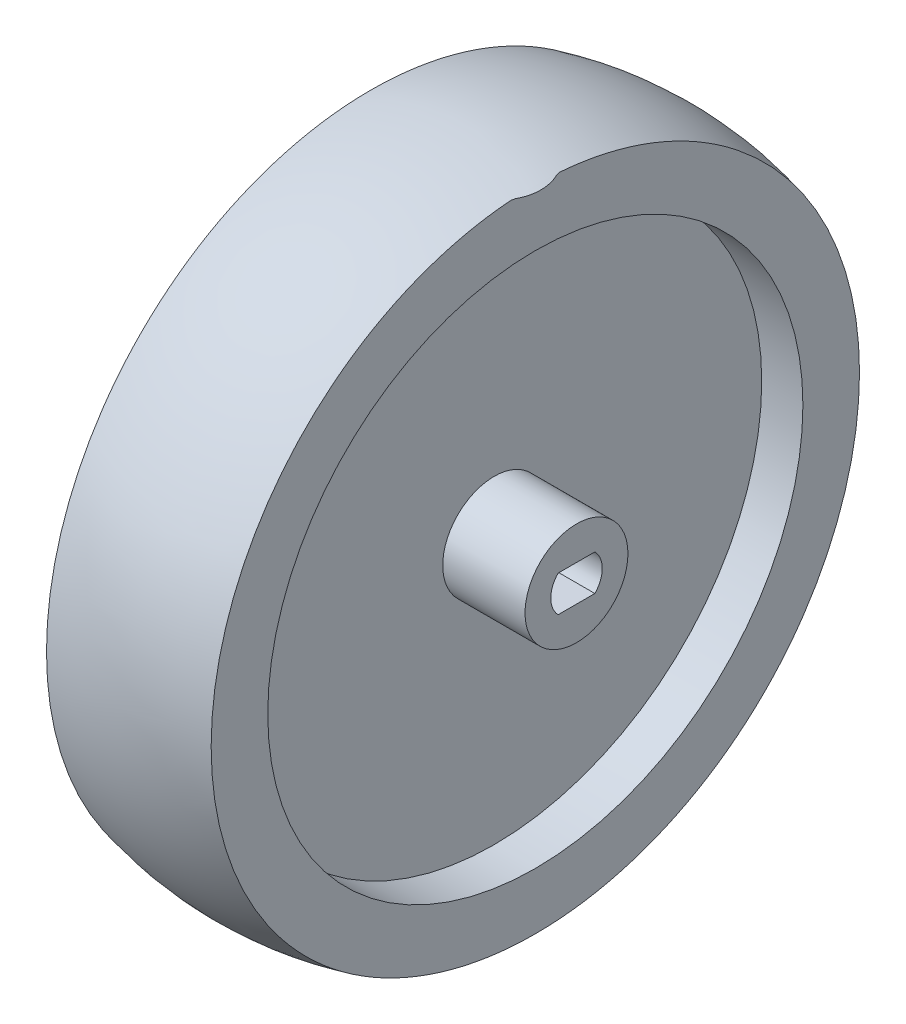
ISO-10303-21;
HEADER;
FILE_DESCRIPTION(('STEP AP214'),'2;1');
FILE_NAME('part.step','',(''),(''),'','','');
FILE_SCHEMA(('AUTOMOTIVE_DESIGN { 1 0 10303 214 1 1 1 1 }'));
ENDSEC;
DATA;
#1=APPLICATION_CONTEXT('core data for automotive mechanical design processes');
#2=APPLICATION_PROTOCOL_DEFINITION('international standard','automotive_design',2000,#1);
#3=PRODUCT_CONTEXT('',#1,'mechanical');
#4=PRODUCT('Part','Part','',(#3));
#5=PRODUCT_RELATED_PRODUCT_CATEGORY('part','',(#4));
#6=PRODUCT_DEFINITION_FORMATION('','',#4);
#7=PRODUCT_DEFINITION_CONTEXT('part definition',#1,'design');
#8=PRODUCT_DEFINITION('design','',#6,#7);
#9=PRODUCT_DEFINITION_SHAPE('','',#8);
#10=(LENGTH_UNIT() NAMED_UNIT(*) SI_UNIT(.MILLI.,.METRE.));
#11=(NAMED_UNIT(*) PLANE_ANGLE_UNIT() SI_UNIT($,.RADIAN.));
#12=(NAMED_UNIT(*) SI_UNIT($,.STERADIAN.) SOLID_ANGLE_UNIT());
#13=UNCERTAINTY_MEASURE_WITH_UNIT(LENGTH_MEASURE(1.E-05),#10,'distance_accuracy_value','');
#14=(GEOMETRIC_REPRESENTATION_CONTEXT(3) GLOBAL_UNCERTAINTY_ASSIGNED_CONTEXT((#13)) GLOBAL_UNIT_ASSIGNED_CONTEXT((#10,
#11,#12)) REPRESENTATION_CONTEXT('',''));
#15=CARTESIAN_POINT('',(0.,0.,0.));
#16=DIRECTION('',(0.,0.,1.));
#17=DIRECTION('',(1.,0.,0.));
#18=AXIS2_PLACEMENT_3D('',#15,#16,#17);
#19=CARTESIAN_POINT('',(4.,0.,0.));
#20=DIRECTION('',(1.,0.,0.));
#21=DIRECTION('',(0.,0.,-1.));
#22=AXIS2_PLACEMENT_3D('',#19,#20,#21);
#23=PLANE('',#22);
#24=CARTESIAN_POINT('',(4.,0.,0.));
#25=DIRECTION('',(1.,0.,0.));
#26=DIRECTION('',(0.,0.,-1.));
#27=AXIS2_PLACEMENT_3D('',#24,#25,#26);
#28=CIRCLE('',#27,1.75);
#29=CARTESIAN_POINT('',(4.,1.75,0.));
#30=VERTEX_POINT('',#29);
#31=CARTESIAN_POINT('',(4.,-1.75,0.));
#32=VERTEX_POINT('',#31);
#33=EDGE_CURVE('E12',#30,#32,#28,.T.);
#34=ORIENTED_EDGE('',*,*,#33,.F.);
#35=DIRECTION('',(0.,0.,1.));
#36=VECTOR('',#35,1.);
#37=CARTESIAN_POINT('',(4.,1.75,1.78535710713571));
#38=LINE('',#37,#36);
#39=CARTESIAN_POINT('',(4.,1.75,1.78535710713571));
#40=VERTEX_POINT('',#39);
#41=EDGE_CURVE('E92',#30,#40,#38,.T.);
#42=ORIENTED_EDGE('',*,*,#41,.T.);
#43=CARTESIAN_POINT('',(4.,0.,0.));
#44=DIRECTION('',(1.,0.,0.));
#45=DIRECTION('',(0.,0.,-1.));
#46=AXIS2_PLACEMENT_3D('',#43,#44,#45);
#47=CIRCLE('',#46,2.5);
#48=CARTESIAN_POINT('',(4.,-1.75,1.78535710713571));
#49=VERTEX_POINT('',#48);
#50=EDGE_CURVE('E56',#40,#49,#47,.T.);
#51=ORIENTED_EDGE('',*,*,#50,.T.);
#52=DIRECTION('',(0.,0.,-1.));
#53=VECTOR('',#52,1.);
#54=CARTESIAN_POINT('',(4.,-1.75,-1.78535710713571));
#55=LINE('',#54,#53);
#56=EDGE_CURVE('E93',#49,#32,#55,.T.);
#57=ORIENTED_EDGE('',*,*,#56,.T.);
#58=EDGE_LOOP('',(#34,#42,#51,#57));
#59=FACE_BOUND('',#58,.T.);
#60=ADVANCED_FACE('F36',(#59),#23,.T.);
#61=CARTESIAN_POINT('',(4.,0.,0.));
#62=DIRECTION('',(1.,0.,0.));
#63=DIRECTION('',(0.,0.,-1.));
#64=AXIS2_PLACEMENT_3D('',#61,#62,#63);
#65=CIRCLE('',#64,26.);
#66=CARTESIAN_POINT('',(4.,0.,-26.));
#67=VERTEX_POINT('',#66);
#68=EDGE_CURVE('E135',#67,#67,#65,.T.);
#69=ORIENTED_EDGE('',*,*,#68,.T.);
#70=EDGE_LOOP('',(#69));
#71=FACE_BOUND('',#70,.T.);
#72=CARTESIAN_POINT('',(4.,0.,0.));
#73=DIRECTION('',(1.,0.,0.));
#74=DIRECTION('',(0.,0.,-1.));
#75=AXIS2_PLACEMENT_3D('',#72,#73,#74);
#76=CIRCLE('',#75,5.);
#77=CARTESIAN_POINT('',(4.,0.,-5.));
#78=VERTEX_POINT('',#77);
#79=EDGE_CURVE('E122',#78,#78,#76,.T.);
#80=ORIENTED_EDGE('',*,*,#79,.F.);
#81=EDGE_LOOP('',(#80));
#82=FACE_BOUND('',#81,.T.);
#83=ADVANCED_FACE('F162',(#71,#82),#23,.T.);
#84=CARTESIAN_POINT('',(0.,0.,0.));
#85=DIRECTION('',(0.119050072874779,0.992888251591542,0.));
#86=DIRECTION('',(-0.992888251591542,0.119050072874779,0.));
#87=AXIS2_PLACEMENT_3D('',#84,#85,#86);
#88=SPHERICAL_SURFACE('',#87,32.5);
#89=CARTESIAN_POINT('',(0.,0.,-32.5));
#90=VERTEX_POINT('',#89);
#91=VERTEX_LOOP('',#90);
#92=FACE_BOUND('',#91,.T.);
#93=CARTESIAN_POINT('',(0.,0.,32.5));
#94=VERTEX_POINT('',#93);
#95=VERTEX_LOOP('',#94);
#96=FACE_BOUND('',#95,.T.);
#97=CARTESIAN_POINT('',(8.,0.,0.));
#98=DIRECTION('',(1.,0.,0.));
#99=DIRECTION('',(0.,0.,-1.));
#100=AXIS2_PLACEMENT_3D('',#97,#98,#99);
#101=CIRCLE('',#100,31.5);
#102=CARTESIAN_POINT('',(8.,0.,-31.5));
#103=VERTEX_POINT('',#102);
#104=EDGE_CURVE('E138',#103,#103,#101,.F.);
#105=ORIENTED_EDGE('',*,*,#104,.T.);
#106=EDGE_LOOP('',(#105));
#107=FACE_BOUND('',#106,.T.);
#108=CARTESIAN_POINT('',(-8.,0.,0.));
#109=DIRECTION('',(-1.,0.,0.));
#110=DIRECTION('',(0.,0.,1.));
#111=AXIS2_PLACEMENT_3D('',#108,#109,#110);
#112=CIRCLE('',#111,31.5);
#113=CARTESIAN_POINT('',(-8.,0.,31.5));
#114=VERTEX_POINT('',#113);
#115=EDGE_CURVE('E90',#114,#114,#112,.F.);
#116=ORIENTED_EDGE('',*,*,#115,.T.);
#117=EDGE_LOOP('',(#116));
#118=FACE_BOUND('',#117,.T.);
#119=ADVANCED_FACE('F38',(#92,#96,#107,#118),#88,.T.);
#120=CARTESIAN_POINT('',(8.,-32.5,-32.5));
#121=DIRECTION('',(1.,0.,0.));
#122=DIRECTION('',(0.,0.,-1.));
#123=AXIS2_PLACEMENT_3D('',#120,#121,#122);
#124=PLANE('',#123);
#125=CARTESIAN_POINT('',(8.,0.,0.));
#126=DIRECTION('',(1.,0.,0.));
#127=DIRECTION('',(0.,0.,-1.));
#128=AXIS2_PLACEMENT_3D('',#125,#126,#127);
#129=CIRCLE('',#128,26.);
#130=CARTESIAN_POINT('',(8.,0.,-26.));
#131=VERTEX_POINT('',#130);
#132=EDGE_CURVE('E132',#131,#131,#129,.T.);
#133=ORIENTED_EDGE('',*,*,#132,.F.);
#134=EDGE_LOOP('',(#133));
#135=FACE_BOUND('',#134,.T.);
#136=ORIENTED_EDGE('',*,*,#104,.F.);
#137=EDGE_LOOP('',(#136));
#138=FACE_BOUND('',#137,.T.);
#139=ADVANCED_FACE('F149',(#135,#138),#124,.T.);
#140=CARTESIAN_POINT('',(-8.,-32.5,-32.5));
#141=DIRECTION('',(-1.,0.,0.));
#142=DIRECTION('',(0.,0.,1.));
#143=AXIS2_PLACEMENT_3D('',#140,#141,#142);
#144=PLANE('',#143);
#145=CARTESIAN_POINT('',(-8.,0.,0.));
#146=DIRECTION('',(-1.,0.,0.));
#147=DIRECTION('',(0.,0.,1.));
#148=AXIS2_PLACEMENT_3D('',#145,#146,#147);
#149=CIRCLE('',#148,26.);
#150=CARTESIAN_POINT('',(-8.,0.,26.));
#151=VERTEX_POINT('',#150);
#152=EDGE_CURVE('E126',#151,#151,#149,.T.);
#153=ORIENTED_EDGE('',*,*,#152,.F.);
#154=EDGE_LOOP('',(#153));
#155=FACE_BOUND('',#154,.T.);
#156=ORIENTED_EDGE('',*,*,#115,.F.);
#157=EDGE_LOOP('',(#156));
#158=FACE_BOUND('',#157,.T.);
#159=ADVANCED_FACE('F146',(#155,#158),#144,.T.);
#160=CARTESIAN_POINT('',(4.,0.,0.));
#161=DIRECTION('',(1.,0.,0.));
#162=DIRECTION('',(0.,0.,-1.));
#163=AXIS2_PLACEMENT_3D('',#160,#161,#162);
#164=CYLINDRICAL_SURFACE('',#163,26.);
#165=ORIENTED_EDGE('',*,*,#68,.F.);
#166=EDGE_LOOP('',(#165));
#167=FACE_BOUND('',#166,.T.);
#168=ORIENTED_EDGE('',*,*,#132,.T.);
#169=EDGE_LOOP('',(#168));
#170=FACE_BOUND('',#169,.T.);
#171=ADVANCED_FACE('F148',(#167,#170),#164,.F.);
#172=CARTESIAN_POINT('',(-4.,0.,0.));
#173=DIRECTION('',(-1.,0.,0.));
#174=DIRECTION('',(0.,0.,1.));
#175=AXIS2_PLACEMENT_3D('',#172,#173,#174);
#176=CYLINDRICAL_SURFACE('',#175,26.);
#177=CARTESIAN_POINT('',(-4.,0.,0.));
#178=DIRECTION('',(-1.,0.,0.));
#179=DIRECTION('',(0.,0.,1.));
#180=AXIS2_PLACEMENT_3D('',#177,#178,#179);
#181=CIRCLE('',#180,26.);
#182=CARTESIAN_POINT('',(-4.,0.,26.));
#183=VERTEX_POINT('',#182);
#184=EDGE_CURVE('E129',#183,#183,#181,.T.);
#185=ORIENTED_EDGE('',*,*,#184,.F.);
#186=EDGE_LOOP('',(#185));
#187=FACE_BOUND('',#186,.T.);
#188=ORIENTED_EDGE('',*,*,#152,.T.);
#189=EDGE_LOOP('',(#188));
#190=FACE_BOUND('',#189,.T.);
#191=ADVANCED_FACE('F155',(#187,#190),#176,.F.);
#192=CARTESIAN_POINT('',(-4.,0.,0.));
#193=DIRECTION('',(-1.,0.,0.));
#194=DIRECTION('',(0.,0.,1.));
#195=AXIS2_PLACEMENT_3D('',#192,#193,#194);
#196=PLANE('',#195);
#197=CARTESIAN_POINT('',(-4.,0.,0.));
#198=DIRECTION('',(-1.,0.,0.));
#199=DIRECTION('',(0.,0.,1.));
#200=AXIS2_PLACEMENT_3D('',#197,#198,#199);
#201=CIRCLE('',#200,4.25);
#202=CARTESIAN_POINT('',(-4.,0.,4.25));
#203=VERTEX_POINT('',#202);
#204=EDGE_CURVE('E328',#203,#203,#201,.T.);
#205=ORIENTED_EDGE('',*,*,#204,.F.);
#206=EDGE_LOOP('',(#205));
#207=FACE_BOUND('',#206,.T.);
#208=ORIENTED_EDGE('',*,*,#184,.T.);
#209=EDGE_LOOP('',(#208));
#210=FACE_BOUND('',#209,.T.);
#211=ADVANCED_FACE('F199',(#207,#210),#196,.T.);
#212=CARTESIAN_POINT('',(12.,0.,0.));
#213=DIRECTION('',(1.,0.,0.));
#214=DIRECTION('',(0.,0.,-1.));
#215=AXIS2_PLACEMENT_3D('',#212,#213,#214);
#216=PLANE('',#215);
#217=CARTESIAN_POINT('',(12.,0.,0.));
#218=DIRECTION('',(1.,0.,0.));
#219=DIRECTION('',(0.,0.,-1.));
#220=AXIS2_PLACEMENT_3D('',#217,#218,#219);
#221=CIRCLE('',#220,5.);
#222=CARTESIAN_POINT('',(12.,0.,-5.));
#223=VERTEX_POINT('',#222);
#224=EDGE_CURVE('E123',#223,#223,#221,.T.);
#225=ORIENTED_EDGE('',*,*,#224,.T.);
#226=EDGE_LOOP('',(#225));
#227=FACE_BOUND('',#226,.T.);
#228=DIRECTION('',(0.,0.,-1.));
#229=VECTOR('',#228,1.);
#230=CARTESIAN_POINT('',(12.,-1.75,-1.78535710713571));
#231=LINE('',#230,#229);
#232=CARTESIAN_POINT('',(12.,-1.75,1.78535710713571));
#233=VERTEX_POINT('',#232);
#234=CARTESIAN_POINT('',(12.,-1.75,-1.78535710713571));
#235=VERTEX_POINT('',#234);
#236=EDGE_CURVE('E107',#233,#235,#231,.T.);
#237=ORIENTED_EDGE('',*,*,#236,.F.);
#238=CARTESIAN_POINT('',(12.,0.,0.));
#239=DIRECTION('',(1.,0.,0.));
#240=DIRECTION('',(0.,0.,-1.));
#241=AXIS2_PLACEMENT_3D('',#238,#239,#240);
#242=CIRCLE('',#241,2.5);
#243=CARTESIAN_POINT('',(12.,1.75,1.78535710713571));
#244=VERTEX_POINT('',#243);
#245=EDGE_CURVE('E106',#244,#233,#242,.T.);
#246=ORIENTED_EDGE('',*,*,#245,.F.);
#247=DIRECTION('',(0.,0.,1.));
#248=VECTOR('',#247,1.);
#249=CARTESIAN_POINT('',(12.,1.75,1.78535710713571));
#250=LINE('',#249,#248);
#251=CARTESIAN_POINT('',(12.,1.75,-1.78535710713571));
#252=VERTEX_POINT('',#251);
#253=EDGE_CURVE('E114',#252,#244,#250,.T.);
#254=ORIENTED_EDGE('',*,*,#253,.F.);
#255=CARTESIAN_POINT('',(12.,0.,0.));
#256=DIRECTION('',(1.,0.,0.));
#257=DIRECTION('',(0.,0.,-1.));
#258=AXIS2_PLACEMENT_3D('',#255,#256,#257);
#259=CIRCLE('',#258,2.5);
#260=EDGE_CURVE('E337',#235,#252,#259,.T.);
#261=ORIENTED_EDGE('',*,*,#260,.F.);
#262=EDGE_LOOP('',(#237,#246,#254,#261));
#263=FACE_BOUND('',#262,.T.);
#264=ADVANCED_FACE('F196',(#227,#263),#216,.T.);
#265=CARTESIAN_POINT('',(12.,0.,0.));
#266=DIRECTION('',(-1.,0.,0.));
#267=DIRECTION('',(0.,0.,1.));
#268=AXIS2_PLACEMENT_3D('',#265,#266,#267);
#269=CYLINDRICAL_SURFACE('',#268,5.);
#270=ORIENTED_EDGE('',*,*,#224,.F.);
#271=EDGE_LOOP('',(#270));
#272=FACE_BOUND('',#271,.T.);
#273=ORIENTED_EDGE('',*,*,#79,.T.);
#274=EDGE_LOOP('',(#273));
#275=FACE_BOUND('',#274,.T.);
#276=ADVANCED_FACE('F194',(#272,#275),#269,.T.);
#277=CARTESIAN_POINT('',(12.,0.,0.));
#278=DIRECTION('',(-1.,0.,0.));
#279=DIRECTION('',(0.,0.,1.));
#280=AXIS2_PLACEMENT_3D('',#277,#278,#279);
#281=CYLINDRICAL_SURFACE('',#280,2.5);
#282=ORIENTED_EDGE('',*,*,#50,.F.);
#283=DIRECTION('',(-1.,0.,0.));
#284=VECTOR('',#283,1.);
#285=CARTESIAN_POINT('',(12.,1.75,1.78535710713571));
#286=LINE('',#285,#284);
#287=EDGE_CURVE('E100',#244,#40,#286,.T.);
#288=ORIENTED_EDGE('',*,*,#287,.F.);
#289=ORIENTED_EDGE('',*,*,#245,.T.);
#290=DIRECTION('',(-1.,0.,0.));
#291=VECTOR('',#290,1.);
#292=CARTESIAN_POINT('',(12.,-1.75,1.78535710713571));
#293=LINE('',#292,#291);
#294=EDGE_CURVE('E119',#233,#49,#293,.T.);
#295=ORIENTED_EDGE('',*,*,#294,.T.);
#296=EDGE_LOOP('',(#282,#288,#289,#295));
#297=FACE_BOUND('',#296,.T.);
#298=ADVANCED_FACE('F190',(#297),#281,.F.);
#299=CARTESIAN_POINT('',(12.,-1.75,-1.78535710713571));
#300=DIRECTION('',(0.,1.,0.));
#301=DIRECTION('',(0.,0.,1.));
#302=AXIS2_PLACEMENT_3D('',#299,#300,#301);
#303=PLANE('',#302);
#304=CARTESIAN_POINT('',(4.,-1.75,-1.78535710713571));
#305=VERTEX_POINT('',#304);
#306=EDGE_CURVE('E330',#32,#305,#55,.T.);
#307=ORIENTED_EDGE('',*,*,#306,.F.);
#308=ORIENTED_EDGE('',*,*,#56,.F.);
#309=ORIENTED_EDGE('',*,*,#294,.F.);
#310=ORIENTED_EDGE('',*,*,#236,.T.);
#311=DIRECTION('',(-1.,0.,0.));
#312=VECTOR('',#311,1.);
#313=CARTESIAN_POINT('',(12.,-1.75,-1.78535710713571));
#314=LINE('',#313,#312);
#315=EDGE_CURVE('E116',#235,#305,#314,.T.);
#316=ORIENTED_EDGE('',*,*,#315,.T.);
#317=EDGE_LOOP('',(#307,#308,#309,#310,#316));
#318=FACE_BOUND('',#317,.T.);
#319=ADVANCED_FACE('F183',(#318),#303,.T.);
#320=CARTESIAN_POINT('',(12.,0.,0.));
#321=DIRECTION('',(-1.,0.,0.));
#322=DIRECTION('',(0.,0.,1.));
#323=AXIS2_PLACEMENT_3D('',#320,#321,#322);
#324=CYLINDRICAL_SURFACE('',#323,2.5);
#325=CARTESIAN_POINT('',(4.,0.,0.));
#326=DIRECTION('',(1.,0.,0.));
#327=DIRECTION('',(0.,0.,-1.));
#328=AXIS2_PLACEMENT_3D('',#325,#326,#327);
#329=CIRCLE('',#328,2.5);
#330=CARTESIAN_POINT('',(4.,1.75,-1.78535710713571));
#331=VERTEX_POINT('',#330);
#332=EDGE_CURVE('E101',#305,#331,#329,.T.);
#333=ORIENTED_EDGE('',*,*,#332,.F.);
#334=ORIENTED_EDGE('',*,*,#315,.F.);
#335=ORIENTED_EDGE('',*,*,#260,.T.);
#336=DIRECTION('',(-1.,0.,0.));
#337=VECTOR('',#336,1.);
#338=CARTESIAN_POINT('',(12.,1.75,-1.78535710713571));
#339=LINE('',#338,#337);
#340=EDGE_CURVE('E113',#252,#331,#339,.T.);
#341=ORIENTED_EDGE('',*,*,#340,.T.);
#342=EDGE_LOOP('',(#333,#334,#335,#341));
#343=FACE_BOUND('',#342,.T.);
#344=ADVANCED_FACE('F178',(#343),#324,.F.);
#345=CARTESIAN_POINT('',(12.,1.75,1.78535710713571));
#346=DIRECTION('',(0.,-1.,0.));
#347=DIRECTION('',(0.,0.,-1.));
#348=AXIS2_PLACEMENT_3D('',#345,#346,#347);
#349=PLANE('',#348);
#350=ORIENTED_EDGE('',*,*,#41,.F.);
#351=EDGE_CURVE('E98',#331,#30,#38,.T.);
#352=ORIENTED_EDGE('',*,*,#351,.F.);
#353=ORIENTED_EDGE('',*,*,#340,.F.);
#354=ORIENTED_EDGE('',*,*,#253,.T.);
#355=ORIENTED_EDGE('',*,*,#287,.T.);
#356=EDGE_LOOP('',(#350,#352,#353,#354,#355));
#357=FACE_BOUND('',#356,.T.);
#358=ADVANCED_FACE('F97',(#357),#349,.T.);
#359=EDGE_CURVE('E40',#32,#30,#28,.T.);
#360=ORIENTED_EDGE('',*,*,#359,.F.);
#361=ORIENTED_EDGE('',*,*,#306,.T.);
#362=ORIENTED_EDGE('',*,*,#332,.T.);
#363=ORIENTED_EDGE('',*,*,#351,.T.);
#364=EDGE_LOOP('',(#360,#361,#362,#363));
#365=FACE_BOUND('',#364,.T.);
#366=ADVANCED_FACE('F103',(#365),#23,.T.);
#367=CARTESIAN_POINT('',(0.,0.,0.));
#368=DIRECTION('',(-1.,0.,0.));
#369=DIRECTION('',(0.,0.,1.));
#370=AXIS2_PLACEMENT_3D('',#367,#368,#369);
#371=CYLINDRICAL_SURFACE('',#370,4.25);
#372=CARTESIAN_POINT('',(0.,0.,0.));
#373=DIRECTION('',(-1.,0.,0.));
#374=DIRECTION('',(0.,0.,1.));
#375=AXIS2_PLACEMENT_3D('',#372,#373,#374);
#376=CIRCLE('',#375,4.25);
#377=CARTESIAN_POINT('',(0.,0.,4.25));
#378=VERTEX_POINT('',#377);
#379=EDGE_CURVE('E327',#378,#378,#376,.T.);
#380=ORIENTED_EDGE('',*,*,#379,.F.);
#381=EDGE_LOOP('',(#380));
#382=FACE_BOUND('',#381,.T.);
#383=ORIENTED_EDGE('',*,*,#204,.T.);
#384=EDGE_LOOP('',(#383));
#385=FACE_BOUND('',#384,.T.);
#386=ADVANCED_FACE('F170',(#382,#385),#371,.F.);
#387=CARTESIAN_POINT('',(0.,0.,0.));
#388=DIRECTION('',(-1.,0.,0.));
#389=DIRECTION('',(0.,0.,1.));
#390=AXIS2_PLACEMENT_3D('',#387,#388,#389);
#391=PLANE('',#390);
#392=CARTESIAN_POINT('',(0.,0.,0.));
#393=DIRECTION('',(-1.,0.,0.));
#394=DIRECTION('',(0.,0.,1.));
#395=AXIS2_PLACEMENT_3D('',#392,#393,#394);
#396=CIRCLE('',#395,1.75);
#397=CARTESIAN_POINT('',(0.,0.,1.75));
#398=VERTEX_POINT('',#397);
#399=EDGE_CURVE('E324',#398,#398,#396,.T.);
#400=ORIENTED_EDGE('',*,*,#399,.F.);
#401=EDGE_LOOP('',(#400));
#402=FACE_BOUND('',#401,.T.);
#403=ORIENTED_EDGE('',*,*,#379,.T.);
#404=EDGE_LOOP('',(#403));
#405=FACE_BOUND('',#404,.T.);
#406=ADVANCED_FACE('F175',(#402,#405),#391,.T.);
#407=CARTESIAN_POINT('',(12.,0.,0.));
#408=DIRECTION('',(-1.,0.,0.));
#409=DIRECTION('',(0.,0.,1.));
#410=AXIS2_PLACEMENT_3D('',#407,#408,#409);
#411=CYLINDRICAL_SURFACE('',#410,1.75);
#412=ORIENTED_EDGE('',*,*,#33,.T.);
#413=ORIENTED_EDGE('',*,*,#359,.T.);
#414=EDGE_LOOP('',(#412,#413));
#415=FACE_BOUND('',#414,.T.);
#416=ORIENTED_EDGE('',*,*,#399,.T.);
#417=EDGE_LOOP('',(#416));
#418=FACE_BOUND('',#417,.T.);
#419=ADVANCED_FACE('F85',(#415,#418),#411,.F.);
#420=CLOSED_SHELL('',(#60,#83,#119,#139,#159,#171,#191,#211,#264,#276,#298,#319,#344,#358,#366,
#386,#406,#419));
#421=MANIFOLD_SOLID_BREP('B2',#420);
#422=ADVANCED_BREP_SHAPE_REPRESENTATION('',(#18,#421),#14);
#423=SHAPE_DEFINITION_REPRESENTATION(#9,#422);
ENDSEC;
END-ISO-10303-21;
